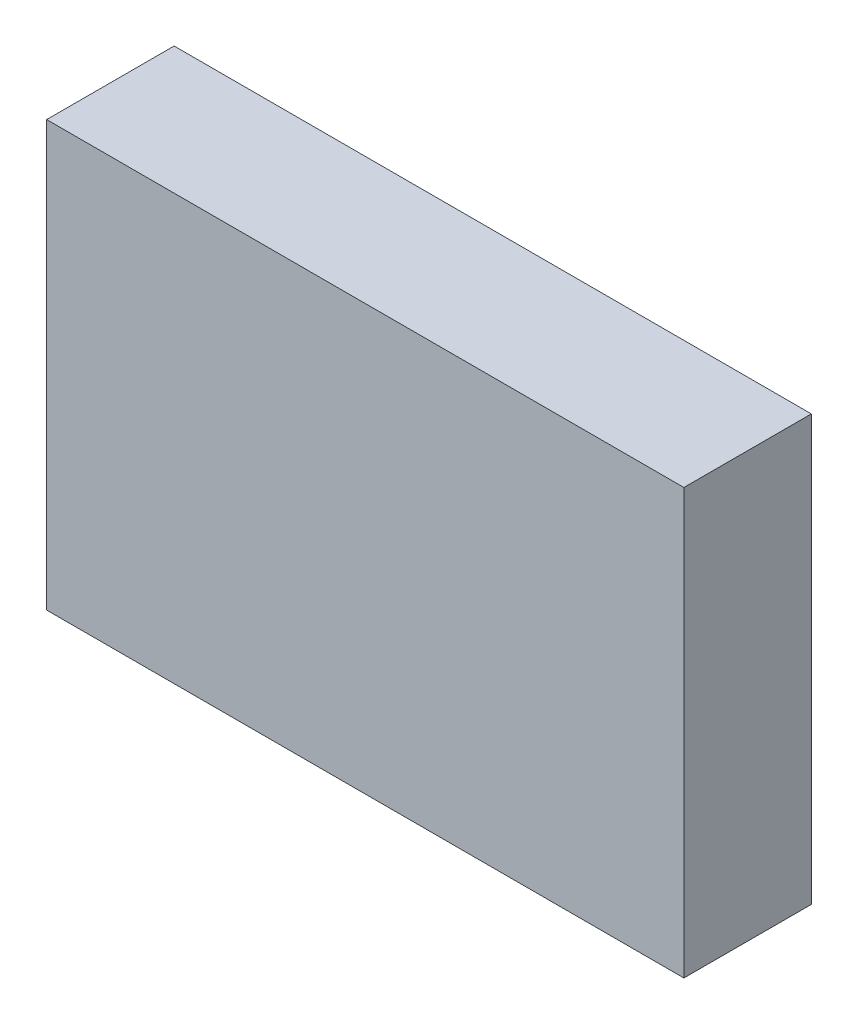
ISO-10303-21;
HEADER;
FILE_DESCRIPTION(('STEP AP214'),'2;1');
FILE_NAME('part.step','',(''),(''),'','','');
FILE_SCHEMA(('AUTOMOTIVE_DESIGN { 1 0 10303 214 1 1 1 1 }'));
ENDSEC;
DATA;
#1=APPLICATION_CONTEXT('core data for automotive mechanical design processes');
#2=APPLICATION_PROTOCOL_DEFINITION('international standard','automotive_design',2000,#1);
#3=PRODUCT_CONTEXT('',#1,'mechanical');
#4=PRODUCT('Part','Part','',(#3));
#5=PRODUCT_RELATED_PRODUCT_CATEGORY('part','',(#4));
#6=PRODUCT_DEFINITION_FORMATION('','',#4);
#7=PRODUCT_DEFINITION_CONTEXT('part definition',#1,'design');
#8=PRODUCT_DEFINITION('design','',#6,#7);
#9=PRODUCT_DEFINITION_SHAPE('','',#8);
#10=(LENGTH_UNIT() NAMED_UNIT(*) SI_UNIT(.MILLI.,.METRE.));
#11=(NAMED_UNIT(*) PLANE_ANGLE_UNIT() SI_UNIT($,.RADIAN.));
#12=(NAMED_UNIT(*) SI_UNIT($,.STERADIAN.) SOLID_ANGLE_UNIT());
#13=UNCERTAINTY_MEASURE_WITH_UNIT(LENGTH_MEASURE(1.E-05),#10,'distance_accuracy_value','');
#14=(GEOMETRIC_REPRESENTATION_CONTEXT(3) GLOBAL_UNCERTAINTY_ASSIGNED_CONTEXT((#13)) GLOBAL_UNIT_ASSIGNED_CONTEXT((#10,
#11,#12)) REPRESENTATION_CONTEXT('',''));
#15=CARTESIAN_POINT('',(0.,0.,0.));
#16=DIRECTION('',(0.,0.,1.));
#17=DIRECTION('',(1.,0.,0.));
#18=AXIS2_PLACEMENT_3D('',#15,#16,#17);
#19=CARTESIAN_POINT('',(75.,-50.,30.));
#20=DIRECTION('',(-1.,0.,0.));
#21=DIRECTION('',(0.,0.,1.));
#22=AXIS2_PLACEMENT_3D('',#19,#20,#21);
#23=PLANE('',#22);
#24=DIRECTION('',(0.,1.,0.));
#25=VECTOR('',#24,1.);
#26=CARTESIAN_POINT('',(75.,-50.,0.));
#27=LINE('',#26,#25);
#28=CARTESIAN_POINT('',(75.,-50.,0.));
#29=VERTEX_POINT('',#28);
#30=CARTESIAN_POINT('',(75.,50.,0.));
#31=VERTEX_POINT('',#30);
#32=EDGE_CURVE('E98',#29,#31,#27,.T.);
#33=ORIENTED_EDGE('',*,*,#32,.T.);
#34=DIRECTION('',(0.,0.,-1.));
#35=VECTOR('',#34,1.);
#36=CARTESIAN_POINT('',(75.,50.,30.));
#37=LINE('',#36,#35);
#38=CARTESIAN_POINT('',(75.,50.,30.));
#39=VERTEX_POINT('',#38);
#40=EDGE_CURVE('E11',#39,#31,#37,.T.);
#41=ORIENTED_EDGE('',*,*,#40,.F.);
#42=DIRECTION('',(0.,1.,0.));
#43=VECTOR('',#42,1.);
#44=CARTESIAN_POINT('',(75.,-50.,30.));
#45=LINE('',#44,#43);
#46=CARTESIAN_POINT('',(75.,-50.,30.));
#47=VERTEX_POINT('',#46);
#48=EDGE_CURVE('E86',#47,#39,#45,.T.);
#49=ORIENTED_EDGE('',*,*,#48,.F.);
#50=DIRECTION('',(0.,0.,-1.));
#51=VECTOR('',#50,1.);
#52=CARTESIAN_POINT('',(75.,-50.,30.));
#53=LINE('',#52,#51);
#54=EDGE_CURVE('E94',#47,#29,#53,.T.);
#55=ORIENTED_EDGE('',*,*,#54,.T.);
#56=EDGE_LOOP('',(#33,#41,#49,#55));
#57=FACE_BOUND('',#56,.T.);
#58=ADVANCED_FACE('F35',(#57),#23,.F.);
#59=CARTESIAN_POINT('',(-75.,50.,30.));
#60=DIRECTION('',(0.,-1.,0.));
#61=DIRECTION('',(1.,0.,0.));
#62=AXIS2_PLACEMENT_3D('',#59,#60,#61);
#63=PLANE('',#62);
#64=DIRECTION('',(-1.,0.,0.));
#65=VECTOR('',#64,1.);
#66=CARTESIAN_POINT('',(-75.,50.,0.));
#67=LINE('',#66,#65);
#68=CARTESIAN_POINT('',(-75.,50.,0.));
#69=VERTEX_POINT('',#68);
#70=EDGE_CURVE('E90',#31,#69,#67,.T.);
#71=ORIENTED_EDGE('',*,*,#70,.T.);
#72=DIRECTION('',(0.,0.,-1.));
#73=VECTOR('',#72,1.);
#74=CARTESIAN_POINT('',(-75.,50.,30.));
#75=LINE('',#74,#73);
#76=CARTESIAN_POINT('',(-75.,50.,30.));
#77=VERTEX_POINT('',#76);
#78=EDGE_CURVE('E43',#77,#69,#75,.T.);
#79=ORIENTED_EDGE('',*,*,#78,.F.);
#80=DIRECTION('',(-1.,0.,0.));
#81=VECTOR('',#80,1.);
#82=CARTESIAN_POINT('',(-75.,50.,30.));
#83=LINE('',#82,#81);
#84=EDGE_CURVE('E81',#39,#77,#83,.T.);
#85=ORIENTED_EDGE('',*,*,#84,.F.);
#86=ORIENTED_EDGE('',*,*,#40,.T.);
#87=EDGE_LOOP('',(#71,#79,#85,#86));
#88=FACE_BOUND('',#87,.T.);
#89=ADVANCED_FACE('F89',(#88),#63,.F.);
#90=CARTESIAN_POINT('',(-75.,-50.,30.));
#91=DIRECTION('',(1.,0.,0.));
#92=DIRECTION('',(0.,0.,-1.));
#93=AXIS2_PLACEMENT_3D('',#90,#91,#92);
#94=PLANE('',#93);
#95=DIRECTION('',(0.,-1.,0.));
#96=VECTOR('',#95,1.);
#97=CARTESIAN_POINT('',(-75.,-50.,0.));
#98=LINE('',#97,#96);
#99=CARTESIAN_POINT('',(-75.,-50.,0.));
#100=VERTEX_POINT('',#99);
#101=EDGE_CURVE('E68',#69,#100,#98,.T.);
#102=ORIENTED_EDGE('',*,*,#101,.T.);
#103=DIRECTION('',(0.,0.,-1.));
#104=VECTOR('',#103,1.);
#105=CARTESIAN_POINT('',(-75.,-50.,30.));
#106=LINE('',#105,#104);
#107=CARTESIAN_POINT('',(-75.,-50.,30.));
#108=VERTEX_POINT('',#107);
#109=EDGE_CURVE('E91',#108,#100,#106,.T.);
#110=ORIENTED_EDGE('',*,*,#109,.F.);
#111=DIRECTION('',(0.,-1.,0.));
#112=VECTOR('',#111,1.);
#113=CARTESIAN_POINT('',(-75.,-50.,30.));
#114=LINE('',#113,#112);
#115=EDGE_CURVE('E84',#77,#108,#114,.T.);
#116=ORIENTED_EDGE('',*,*,#115,.F.);
#117=ORIENTED_EDGE('',*,*,#78,.T.);
#118=EDGE_LOOP('',(#102,#110,#116,#117));
#119=FACE_BOUND('',#118,.T.);
#120=ADVANCED_FACE('F92',(#119),#94,.F.);
#121=CARTESIAN_POINT('',(-75.,-50.,30.));
#122=DIRECTION('',(0.,1.,0.));
#123=DIRECTION('',(-1.,0.,0.));
#124=AXIS2_PLACEMENT_3D('',#121,#122,#123);
#125=PLANE('',#124);
#126=DIRECTION('',(1.,0.,0.));
#127=VECTOR('',#126,1.);
#128=CARTESIAN_POINT('',(-75.,-50.,0.));
#129=LINE('',#128,#127);
#130=EDGE_CURVE('E74',#100,#29,#129,.T.);
#131=ORIENTED_EDGE('',*,*,#130,.T.);
#132=ORIENTED_EDGE('',*,*,#54,.F.);
#133=DIRECTION('',(1.,0.,0.));
#134=VECTOR('',#133,1.);
#135=CARTESIAN_POINT('',(-75.,-50.,30.));
#136=LINE('',#135,#134);
#137=EDGE_CURVE('E51',#108,#47,#136,.T.);
#138=ORIENTED_EDGE('',*,*,#137,.F.);
#139=ORIENTED_EDGE('',*,*,#109,.T.);
#140=EDGE_LOOP('',(#131,#132,#138,#139));
#141=FACE_BOUND('',#140,.T.);
#142=ADVANCED_FACE('F105',(#141),#125,.F.);
#143=CARTESIAN_POINT('',(0.,0.,30.));
#144=DIRECTION('',(0.,0.,-1.));
#145=DIRECTION('',(-1.,0.,0.));
#146=AXIS2_PLACEMENT_3D('',#143,#144,#145);
#147=PLANE('',#146);
#148=ORIENTED_EDGE('',*,*,#48,.T.);
#149=ORIENTED_EDGE('',*,*,#84,.T.);
#150=ORIENTED_EDGE('',*,*,#115,.T.);
#151=ORIENTED_EDGE('',*,*,#137,.T.);
#152=EDGE_LOOP('',(#148,#149,#150,#151));
#153=FACE_BOUND('',#152,.T.);
#154=ADVANCED_FACE('F82',(#153),#147,.F.);
#155=CARTESIAN_POINT('',(0.,0.,0.));
#156=DIRECTION('',(0.,0.,-1.));
#157=DIRECTION('',(-1.,0.,0.));
#158=AXIS2_PLACEMENT_3D('',#155,#156,#157);
#159=PLANE('',#158);
#160=ORIENTED_EDGE('',*,*,#32,.F.);
#161=ORIENTED_EDGE('',*,*,#130,.F.);
#162=ORIENTED_EDGE('',*,*,#101,.F.);
#163=ORIENTED_EDGE('',*,*,#70,.F.);
#164=EDGE_LOOP('',(#160,#161,#162,#163));
#165=FACE_BOUND('',#164,.T.);
#166=ADVANCED_FACE('F108',(#165),#159,.T.);
#167=CLOSED_SHELL('',(#58,#89,#120,#142,#154,#166));
#168=MANIFOLD_SOLID_BREP('B2',#167);
#169=ADVANCED_BREP_SHAPE_REPRESENTATION('',(#18,#168),#14);
#170=SHAPE_DEFINITION_REPRESENTATION(#9,#169);
ENDSEC;
END-ISO-10303-21;
